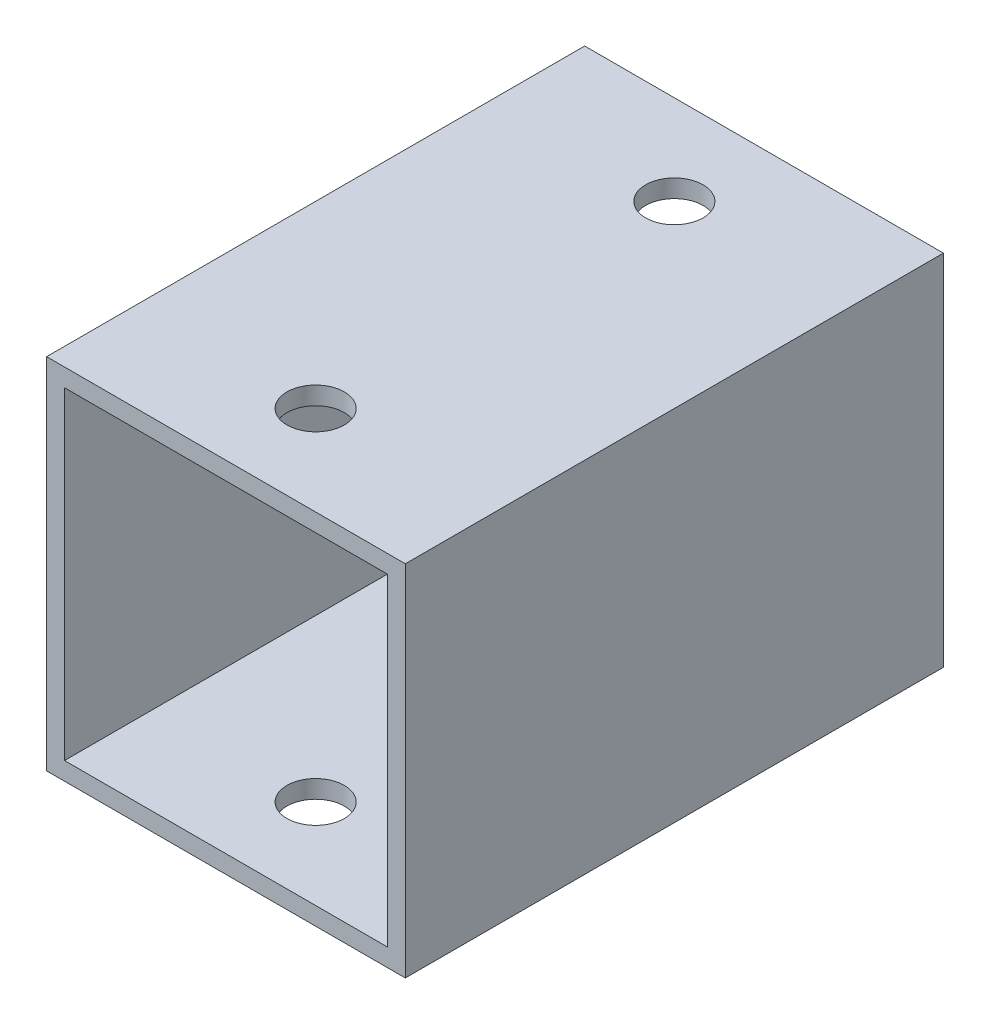
ISO-10303-21;
HEADER;
FILE_DESCRIPTION(('STEP AP214'),'2;1');
FILE_NAME('part.step','',(''),(''),'','','');
FILE_SCHEMA(('AUTOMOTIVE_DESIGN { 1 0 10303 214 1 1 1 1 }'));
ENDSEC;
DATA;
#1=APPLICATION_CONTEXT('core data for automotive mechanical design processes');
#2=APPLICATION_PROTOCOL_DEFINITION('international standard','automotive_design',2000,#1);
#3=PRODUCT_CONTEXT('',#1,'mechanical');
#4=PRODUCT('Part','Part','',(#3));
#5=PRODUCT_RELATED_PRODUCT_CATEGORY('part','',(#4));
#6=PRODUCT_DEFINITION_FORMATION('','',#4);
#7=PRODUCT_DEFINITION_CONTEXT('part definition',#1,'design');
#8=PRODUCT_DEFINITION('design','',#6,#7);
#9=PRODUCT_DEFINITION_SHAPE('','',#8);
#10=(LENGTH_UNIT() NAMED_UNIT(*) SI_UNIT(.MILLI.,.METRE.));
#11=(NAMED_UNIT(*) PLANE_ANGLE_UNIT() SI_UNIT($,.RADIAN.));
#12=(NAMED_UNIT(*) SI_UNIT($,.STERADIAN.) SOLID_ANGLE_UNIT());
#13=UNCERTAINTY_MEASURE_WITH_UNIT(LENGTH_MEASURE(1.E-05),#10,'distance_accuracy_value','');
#14=(GEOMETRIC_REPRESENTATION_CONTEXT(3) GLOBAL_UNCERTAINTY_ASSIGNED_CONTEXT((#13)) GLOBAL_UNIT_ASSIGNED_CONTEXT((#10,
#11,#12)) REPRESENTATION_CONTEXT('',''));
#15=CARTESIAN_POINT('',(0.,0.,0.));
#16=DIRECTION('',(0.,0.,1.));
#17=DIRECTION('',(1.,0.,0.));
#18=AXIS2_PLACEMENT_3D('',#15,#16,#17);
#19=CARTESIAN_POINT('',(0.,0.,30.));
#20=DIRECTION('',(0.,0.,1.));
#21=DIRECTION('',(1.,0.,0.));
#22=AXIS2_PLACEMENT_3D('',#19,#20,#21);
#23=PLANE('',#22);
#24=DIRECTION('',(0.,1.,0.));
#25=VECTOR('',#24,1.);
#26=CARTESIAN_POINT('',(9.99999999999999,10.,30.));
#27=LINE('',#26,#25);
#28=CARTESIAN_POINT('',(10.,-10.,30.));
#29=VERTEX_POINT('',#28);
#30=CARTESIAN_POINT('',(9.99999999999999,10.,30.));
#31=VERTEX_POINT('',#30);
#32=EDGE_CURVE('E162',#29,#31,#27,.T.);
#33=ORIENTED_EDGE('',*,*,#32,.T.);
#34=DIRECTION('',(-1.,0.,0.));
#35=VECTOR('',#34,1.);
#36=CARTESIAN_POINT('',(-10.,10.,30.));
#37=LINE('',#36,#35);
#38=CARTESIAN_POINT('',(-10.,10.,30.));
#39=VERTEX_POINT('',#38);
#40=EDGE_CURVE('E170',#31,#39,#37,.T.);
#41=ORIENTED_EDGE('',*,*,#40,.T.);
#42=DIRECTION('',(0.,-1.,0.));
#43=VECTOR('',#42,1.);
#44=CARTESIAN_POINT('',(-10.,10.,30.));
#45=LINE('',#44,#43);
#46=CARTESIAN_POINT('',(-10.,-10.,30.));
#47=VERTEX_POINT('',#46);
#48=EDGE_CURVE('E173',#39,#47,#45,.T.);
#49=ORIENTED_EDGE('',*,*,#48,.T.);
#50=DIRECTION('',(1.,0.,0.));
#51=VECTOR('',#50,1.);
#52=CARTESIAN_POINT('',(-10.,-10.,30.));
#53=LINE('',#52,#51);
#54=EDGE_CURVE('E175',#47,#29,#53,.T.);
#55=ORIENTED_EDGE('',*,*,#54,.T.);
#56=EDGE_LOOP('',(#33,#41,#49,#55));
#57=FACE_BOUND('',#56,.T.);
#58=DIRECTION('',(-1.,0.,0.));
#59=VECTOR('',#58,1.);
#60=CARTESIAN_POINT('',(-9.,9.,30.));
#61=LINE('',#60,#59);
#62=CARTESIAN_POINT('',(9.,9.,30.));
#63=VERTEX_POINT('',#62);
#64=CARTESIAN_POINT('',(-9.,9.,30.));
#65=VERTEX_POINT('',#64);
#66=EDGE_CURVE('E124',#63,#65,#61,.T.);
#67=ORIENTED_EDGE('',*,*,#66,.F.);
#68=DIRECTION('',(0.,1.,0.));
#69=VECTOR('',#68,1.);
#70=CARTESIAN_POINT('',(9.,9.,30.));
#71=LINE('',#70,#69);
#72=CARTESIAN_POINT('',(9.,-9.,30.));
#73=VERTEX_POINT('',#72);
#74=EDGE_CURVE('E114',#73,#63,#71,.T.);
#75=ORIENTED_EDGE('',*,*,#74,.F.);
#76=DIRECTION('',(1.,0.,0.));
#77=VECTOR('',#76,1.);
#78=CARTESIAN_POINT('',(-9.,-9.,30.));
#79=LINE('',#78,#77);
#80=CARTESIAN_POINT('',(-9.,-9.,30.));
#81=VERTEX_POINT('',#80);
#82=EDGE_CURVE('E140',#81,#73,#79,.T.);
#83=ORIENTED_EDGE('',*,*,#82,.F.);
#84=DIRECTION('',(0.,-1.,0.));
#85=VECTOR('',#84,1.);
#86=CARTESIAN_POINT('',(-9.,9.,30.));
#87=LINE('',#86,#85);
#88=EDGE_CURVE('E131',#65,#81,#87,.T.);
#89=ORIENTED_EDGE('',*,*,#88,.F.);
#90=EDGE_LOOP('',(#67,#75,#83,#89));
#91=FACE_BOUND('',#90,.T.);
#92=ADVANCED_FACE('F44',(#57,#91),#23,.T.);
#93=CARTESIAN_POINT('',(0.,0.,0.));
#94=DIRECTION('',(0.,0.,1.));
#95=DIRECTION('',(1.,0.,0.));
#96=AXIS2_PLACEMENT_3D('',#93,#94,#95);
#97=PLANE('',#96);
#98=DIRECTION('',(0.,1.,0.));
#99=VECTOR('',#98,1.);
#100=CARTESIAN_POINT('',(9.99999999999999,10.,0.));
#101=LINE('',#100,#99);
#102=CARTESIAN_POINT('',(10.,-10.,0.));
#103=VERTEX_POINT('',#102);
#104=CARTESIAN_POINT('',(9.99999999999999,10.,0.));
#105=VERTEX_POINT('',#104);
#106=EDGE_CURVE('E133',#103,#105,#101,.T.);
#107=ORIENTED_EDGE('',*,*,#106,.F.);
#108=DIRECTION('',(1.,0.,0.));
#109=VECTOR('',#108,1.);
#110=CARTESIAN_POINT('',(-10.,-10.,0.));
#111=LINE('',#110,#109);
#112=CARTESIAN_POINT('',(-10.,-10.,0.));
#113=VERTEX_POINT('',#112);
#114=EDGE_CURVE('E169',#113,#103,#111,.T.);
#115=ORIENTED_EDGE('',*,*,#114,.F.);
#116=DIRECTION('',(0.,-1.,0.));
#117=VECTOR('',#116,1.);
#118=CARTESIAN_POINT('',(-10.,10.,0.));
#119=LINE('',#118,#117);
#120=CARTESIAN_POINT('',(-10.,10.,0.));
#121=VERTEX_POINT('',#120);
#122=EDGE_CURVE('E184',#121,#113,#119,.T.);
#123=ORIENTED_EDGE('',*,*,#122,.F.);
#124=DIRECTION('',(-1.,0.,0.));
#125=VECTOR('',#124,1.);
#126=CARTESIAN_POINT('',(-10.,10.,0.));
#127=LINE('',#126,#125);
#128=EDGE_CURVE('E182',#105,#121,#127,.T.);
#129=ORIENTED_EDGE('',*,*,#128,.F.);
#130=EDGE_LOOP('',(#107,#115,#123,#129));
#131=FACE_BOUND('',#130,.T.);
#132=DIRECTION('',(0.,1.,0.));
#133=VECTOR('',#132,1.);
#134=CARTESIAN_POINT('',(9.,9.,0.));
#135=LINE('',#134,#133);
#136=CARTESIAN_POINT('',(9.,-9.,0.));
#137=VERTEX_POINT('',#136);
#138=CARTESIAN_POINT('',(9.,9.,0.));
#139=VERTEX_POINT('',#138);
#140=EDGE_CURVE('E72',#137,#139,#135,.T.);
#141=ORIENTED_EDGE('',*,*,#140,.T.);
#142=DIRECTION('',(-1.,0.,0.));
#143=VECTOR('',#142,1.);
#144=CARTESIAN_POINT('',(-9.,9.,0.));
#145=LINE('',#144,#143);
#146=CARTESIAN_POINT('',(-9.,9.,0.));
#147=VERTEX_POINT('',#146);
#148=EDGE_CURVE('E129',#139,#147,#145,.T.);
#149=ORIENTED_EDGE('',*,*,#148,.T.);
#150=DIRECTION('',(0.,-1.,0.));
#151=VECTOR('',#150,1.);
#152=CARTESIAN_POINT('',(-9.,9.,0.));
#153=LINE('',#152,#151);
#154=CARTESIAN_POINT('',(-9.,-9.,0.));
#155=VERTEX_POINT('',#154);
#156=EDGE_CURVE('E147',#147,#155,#153,.T.);
#157=ORIENTED_EDGE('',*,*,#156,.T.);
#158=DIRECTION('',(1.,0.,0.));
#159=VECTOR('',#158,1.);
#160=CARTESIAN_POINT('',(-9.,-9.,0.));
#161=LINE('',#160,#159);
#162=EDGE_CURVE('E122',#155,#137,#161,.T.);
#163=ORIENTED_EDGE('',*,*,#162,.T.);
#164=EDGE_LOOP('',(#141,#149,#157,#163));
#165=FACE_BOUND('',#164,.T.);
#166=ADVANCED_FACE('F246',(#131,#165),#97,.F.);
#167=CARTESIAN_POINT('',(9.99999999999999,10.,30.));
#168=DIRECTION('',(-1.,0.,0.));
#169=DIRECTION('',(0.,-1.,0.));
#170=AXIS2_PLACEMENT_3D('',#167,#168,#169);
#171=PLANE('',#170);
#172=ORIENTED_EDGE('',*,*,#106,.T.);
#173=DIRECTION('',(0.,0.,-1.));
#174=VECTOR('',#173,1.);
#175=CARTESIAN_POINT('',(9.99999999999999,10.,30.));
#176=LINE('',#175,#174);
#177=EDGE_CURVE('E11',#31,#105,#176,.T.);
#178=ORIENTED_EDGE('',*,*,#177,.F.);
#179=ORIENTED_EDGE('',*,*,#32,.F.);
#180=DIRECTION('',(0.,0.,-1.));
#181=VECTOR('',#180,1.);
#182=CARTESIAN_POINT('',(10.,-10.,30.));
#183=LINE('',#182,#181);
#184=EDGE_CURVE('E179',#29,#103,#183,.T.);
#185=ORIENTED_EDGE('',*,*,#184,.T.);
#186=EDGE_LOOP('',(#172,#178,#179,#185));
#187=FACE_BOUND('',#186,.T.);
#188=ADVANCED_FACE('F50',(#187),#171,.F.);
#189=CARTESIAN_POINT('',(-10.,10.,30.));
#190=DIRECTION('',(0.,-1.,0.));
#191=DIRECTION('',(0.,0.,-1.));
#192=AXIS2_PLACEMENT_3D('',#189,#190,#191);
#193=PLANE('',#192);
#194=CARTESIAN_POINT('',(0.,10.,5.));
#195=DIRECTION('',(0.,1.,0.));
#196=DIRECTION('',(0.,0.,1.));
#197=AXIS2_PLACEMENT_3D('',#194,#195,#196);
#198=CIRCLE('',#197,1.6);
#199=CARTESIAN_POINT('',(0.,10.,6.6));
#200=VERTEX_POINT('',#199);
#201=EDGE_CURVE('E205',#200,#200,#198,.T.);
#202=ORIENTED_EDGE('',*,*,#201,.F.);
#203=EDGE_LOOP('',(#202));
#204=FACE_BOUND('',#203,.T.);
#205=CARTESIAN_POINT('',(0.,10.,25.));
#206=DIRECTION('',(0.,1.,0.));
#207=DIRECTION('',(0.,0.,1.));
#208=AXIS2_PLACEMENT_3D('',#205,#206,#207);
#209=CIRCLE('',#208,1.6);
#210=CARTESIAN_POINT('',(0.,10.,26.6));
#211=VERTEX_POINT('',#210);
#212=EDGE_CURVE('E211',#211,#211,#209,.T.);
#213=ORIENTED_EDGE('',*,*,#212,.F.);
#214=EDGE_LOOP('',(#213));
#215=FACE_BOUND('',#214,.T.);
#216=ORIENTED_EDGE('',*,*,#128,.T.);
#217=DIRECTION('',(0.,0.,-1.));
#218=VECTOR('',#217,1.);
#219=CARTESIAN_POINT('',(-10.,10.,30.));
#220=LINE('',#219,#218);
#221=EDGE_CURVE('E54',#39,#121,#220,.T.);
#222=ORIENTED_EDGE('',*,*,#221,.F.);
#223=ORIENTED_EDGE('',*,*,#40,.F.);
#224=ORIENTED_EDGE('',*,*,#177,.T.);
#225=EDGE_LOOP('',(#216,#222,#223,#224));
#226=FACE_BOUND('',#225,.T.);
#227=ADVANCED_FACE('F264',(#204,#215,#226),#193,.F.);
#228=CARTESIAN_POINT('',(-10.,10.,30.));
#229=DIRECTION('',(1.,0.,0.));
#230=DIRECTION('',(0.,1.,0.));
#231=AXIS2_PLACEMENT_3D('',#228,#229,#230);
#232=PLANE('',#231);
#233=ORIENTED_EDGE('',*,*,#122,.T.);
#234=DIRECTION('',(0.,0.,-1.));
#235=VECTOR('',#234,1.);
#236=CARTESIAN_POINT('',(-10.,-10.,30.));
#237=LINE('',#236,#235);
#238=EDGE_CURVE('E194',#47,#113,#237,.T.);
#239=ORIENTED_EDGE('',*,*,#238,.F.);
#240=ORIENTED_EDGE('',*,*,#48,.F.);
#241=ORIENTED_EDGE('',*,*,#221,.T.);
#242=EDGE_LOOP('',(#233,#239,#240,#241));
#243=FACE_BOUND('',#242,.T.);
#244=ADVANCED_FACE('F263',(#243),#232,.F.);
#245=CARTESIAN_POINT('',(-10.,-10.,30.));
#246=DIRECTION('',(0.,1.,0.));
#247=DIRECTION('',(0.,0.,1.));
#248=AXIS2_PLACEMENT_3D('',#245,#246,#247);
#249=PLANE('',#248);
#250=CARTESIAN_POINT('',(0.,-10.,5.));
#251=DIRECTION('',(0.,1.,0.));
#252=DIRECTION('',(0.,0.,1.));
#253=AXIS2_PLACEMENT_3D('',#250,#251,#252);
#254=CIRCLE('',#253,1.6);
#255=CARTESIAN_POINT('',(0.,-10.,6.6));
#256=VERTEX_POINT('',#255);
#257=EDGE_CURVE('E150',#256,#256,#254,.T.);
#258=ORIENTED_EDGE('',*,*,#257,.T.);
#259=EDGE_LOOP('',(#258));
#260=FACE_BOUND('',#259,.T.);
#261=CARTESIAN_POINT('',(0.,-10.,25.));
#262=DIRECTION('',(0.,1.,0.));
#263=DIRECTION('',(0.,0.,1.));
#264=AXIS2_PLACEMENT_3D('',#261,#262,#263);
#265=CIRCLE('',#264,1.6);
#266=CARTESIAN_POINT('',(0.,-10.,26.6));
#267=VERTEX_POINT('',#266);
#268=EDGE_CURVE('E208',#267,#267,#265,.T.);
#269=ORIENTED_EDGE('',*,*,#268,.T.);
#270=EDGE_LOOP('',(#269));
#271=FACE_BOUND('',#270,.T.);
#272=ORIENTED_EDGE('',*,*,#114,.T.);
#273=ORIENTED_EDGE('',*,*,#184,.F.);
#274=ORIENTED_EDGE('',*,*,#54,.F.);
#275=ORIENTED_EDGE('',*,*,#238,.T.);
#276=EDGE_LOOP('',(#272,#273,#274,#275));
#277=FACE_BOUND('',#276,.T.);
#278=ADVANCED_FACE('F230',(#260,#271,#277),#249,.F.);
#279=CARTESIAN_POINT('',(9.,9.,30.));
#280=DIRECTION('',(-1.,0.,0.));
#281=DIRECTION('',(0.,-1.,0.));
#282=AXIS2_PLACEMENT_3D('',#279,#280,#281);
#283=PLANE('',#282);
#284=ORIENTED_EDGE('',*,*,#140,.F.);
#285=DIRECTION('',(0.,0.,-1.));
#286=VECTOR('',#285,1.);
#287=CARTESIAN_POINT('',(9.,-9.,30.));
#288=LINE('',#287,#286);
#289=EDGE_CURVE('E119',#73,#137,#288,.T.);
#290=ORIENTED_EDGE('',*,*,#289,.F.);
#291=ORIENTED_EDGE('',*,*,#74,.T.);
#292=DIRECTION('',(0.,0.,-1.));
#293=VECTOR('',#292,1.);
#294=CARTESIAN_POINT('',(9.,9.,30.));
#295=LINE('',#294,#293);
#296=EDGE_CURVE('E118',#63,#139,#295,.T.);
#297=ORIENTED_EDGE('',*,*,#296,.T.);
#298=EDGE_LOOP('',(#284,#290,#291,#297));
#299=FACE_BOUND('',#298,.T.);
#300=ADVANCED_FACE('F113',(#299),#283,.T.);
#301=CARTESIAN_POINT('',(-9.,9.,30.));
#302=DIRECTION('',(0.,-1.,0.));
#303=DIRECTION('',(0.,0.,-1.));
#304=AXIS2_PLACEMENT_3D('',#301,#302,#303);
#305=PLANE('',#304);
#306=CARTESIAN_POINT('',(0.,9.,5.));
#307=DIRECTION('',(0.,-1.,0.));
#308=DIRECTION('',(0.,0.,-1.));
#309=AXIS2_PLACEMENT_3D('',#306,#307,#308);
#310=CIRCLE('',#309,1.6);
#311=CARTESIAN_POINT('',(0.,9.,3.4));
#312=VERTEX_POINT('',#311);
#313=EDGE_CURVE('E225',#312,#312,#310,.T.);
#314=ORIENTED_EDGE('',*,*,#313,.F.);
#315=EDGE_LOOP('',(#314));
#316=FACE_BOUND('',#315,.T.);
#317=CARTESIAN_POINT('',(0.,9.,25.));
#318=DIRECTION('',(0.,-1.,0.));
#319=DIRECTION('',(0.,0.,-1.));
#320=AXIS2_PLACEMENT_3D('',#317,#318,#319);
#321=CIRCLE('',#320,1.6);
#322=CARTESIAN_POINT('',(0.,9.,23.4));
#323=VERTEX_POINT('',#322);
#324=EDGE_CURVE('E203',#323,#323,#321,.T.);
#325=ORIENTED_EDGE('',*,*,#324,.F.);
#326=EDGE_LOOP('',(#325));
#327=FACE_BOUND('',#326,.T.);
#328=ORIENTED_EDGE('',*,*,#148,.F.);
#329=ORIENTED_EDGE('',*,*,#296,.F.);
#330=ORIENTED_EDGE('',*,*,#66,.T.);
#331=DIRECTION('',(0.,0.,-1.));
#332=VECTOR('',#331,1.);
#333=CARTESIAN_POINT('',(-9.,9.,30.));
#334=LINE('',#333,#332);
#335=EDGE_CURVE('E134',#65,#147,#334,.T.);
#336=ORIENTED_EDGE('',*,*,#335,.T.);
#337=EDGE_LOOP('',(#328,#329,#330,#336));
#338=FACE_BOUND('',#337,.T.);
#339=ADVANCED_FACE('F127',(#316,#327,#338),#305,.T.);
#340=CARTESIAN_POINT('',(-9.,9.,30.));
#341=DIRECTION('',(1.,0.,0.));
#342=DIRECTION('',(0.,1.,0.));
#343=AXIS2_PLACEMENT_3D('',#340,#341,#342);
#344=PLANE('',#343);
#345=ORIENTED_EDGE('',*,*,#156,.F.);
#346=ORIENTED_EDGE('',*,*,#335,.F.);
#347=ORIENTED_EDGE('',*,*,#88,.T.);
#348=DIRECTION('',(0.,0.,-1.));
#349=VECTOR('',#348,1.);
#350=CARTESIAN_POINT('',(-9.,-9.,30.));
#351=LINE('',#350,#349);
#352=EDGE_CURVE('E62',#81,#155,#351,.T.);
#353=ORIENTED_EDGE('',*,*,#352,.T.);
#354=EDGE_LOOP('',(#345,#346,#347,#353));
#355=FACE_BOUND('',#354,.T.);
#356=ADVANCED_FACE('F292',(#355),#344,.T.);
#357=CARTESIAN_POINT('',(-9.,-9.,30.));
#358=DIRECTION('',(0.,1.,0.));
#359=DIRECTION('',(0.,0.,1.));
#360=AXIS2_PLACEMENT_3D('',#357,#358,#359);
#361=PLANE('',#360);
#362=CARTESIAN_POINT('',(0.,-9.,5.));
#363=DIRECTION('',(0.,1.,0.));
#364=DIRECTION('',(0.,0.,1.));
#365=AXIS2_PLACEMENT_3D('',#362,#363,#364);
#366=CIRCLE('',#365,1.6);
#367=CARTESIAN_POINT('',(0.,-9.,6.6));
#368=VERTEX_POINT('',#367);
#369=EDGE_CURVE('E47',#368,#368,#366,.T.);
#370=ORIENTED_EDGE('',*,*,#369,.F.);
#371=EDGE_LOOP('',(#370));
#372=FACE_BOUND('',#371,.T.);
#373=CARTESIAN_POINT('',(0.,-9.,25.));
#374=DIRECTION('',(0.,1.,0.));
#375=DIRECTION('',(0.,0.,1.));
#376=AXIS2_PLACEMENT_3D('',#373,#374,#375);
#377=CIRCLE('',#376,1.6);
#378=CARTESIAN_POINT('',(0.,-9.,26.6));
#379=VERTEX_POINT('',#378);
#380=EDGE_CURVE('E196',#379,#379,#377,.T.);
#381=ORIENTED_EDGE('',*,*,#380,.F.);
#382=EDGE_LOOP('',(#381));
#383=FACE_BOUND('',#382,.T.);
#384=ORIENTED_EDGE('',*,*,#162,.F.);
#385=ORIENTED_EDGE('',*,*,#352,.F.);
#386=ORIENTED_EDGE('',*,*,#82,.T.);
#387=ORIENTED_EDGE('',*,*,#289,.T.);
#388=EDGE_LOOP('',(#384,#385,#386,#387));
#389=FACE_BOUND('',#388,.T.);
#390=ADVANCED_FACE('F241',(#372,#383,#389),#361,.T.);
#391=CARTESIAN_POINT('',(0.,-40.,25.));
#392=DIRECTION('',(0.,1.,0.));
#393=DIRECTION('',(0.,0.,1.));
#394=AXIS2_PLACEMENT_3D('',#391,#392,#393);
#395=CYLINDRICAL_SURFACE('',#394,1.6);
#396=ORIENTED_EDGE('',*,*,#380,.T.);
#397=EDGE_LOOP('',(#396));
#398=FACE_BOUND('',#397,.T.);
#399=ORIENTED_EDGE('',*,*,#268,.F.);
#400=EDGE_LOOP('',(#399));
#401=FACE_BOUND('',#400,.T.);
#402=ADVANCED_FACE('F231',(#398,#401),#395,.F.);
#403=CARTESIAN_POINT('',(0.,-40.,5.));
#404=DIRECTION('',(0.,1.,0.));
#405=DIRECTION('',(0.,0.,1.));
#406=AXIS2_PLACEMENT_3D('',#403,#404,#405);
#407=CYLINDRICAL_SURFACE('',#406,1.6);
#408=ORIENTED_EDGE('',*,*,#369,.T.);
#409=EDGE_LOOP('',(#408));
#410=FACE_BOUND('',#409,.T.);
#411=ORIENTED_EDGE('',*,*,#257,.F.);
#412=EDGE_LOOP('',(#411));
#413=FACE_BOUND('',#412,.T.);
#414=ADVANCED_FACE('F234',(#410,#413),#407,.F.);
#415=ORIENTED_EDGE('',*,*,#324,.T.);
#416=EDGE_LOOP('',(#415));
#417=FACE_BOUND('',#416,.T.);
#418=ORIENTED_EDGE('',*,*,#212,.T.);
#419=EDGE_LOOP('',(#418));
#420=FACE_BOUND('',#419,.T.);
#421=ADVANCED_FACE('F235',(#417,#420),#395,.F.);
#422=ORIENTED_EDGE('',*,*,#313,.T.);
#423=EDGE_LOOP('',(#422));
#424=FACE_BOUND('',#423,.T.);
#425=ORIENTED_EDGE('',*,*,#201,.T.);
#426=EDGE_LOOP('',(#425));
#427=FACE_BOUND('',#426,.T.);
#428=ADVANCED_FACE('F236',(#424,#427),#407,.F.);
#429=CLOSED_SHELL('',(#92,#166,#188,#227,#244,#278,#300,#339,#356,#390,#402,#414,#421,#428));
#430=MANIFOLD_SOLID_BREP('B2',#429);
#431=ADVANCED_BREP_SHAPE_REPRESENTATION('',(#18,#430),#14);
#432=SHAPE_DEFINITION_REPRESENTATION(#9,#431);
ENDSEC;
END-ISO-10303-21;
